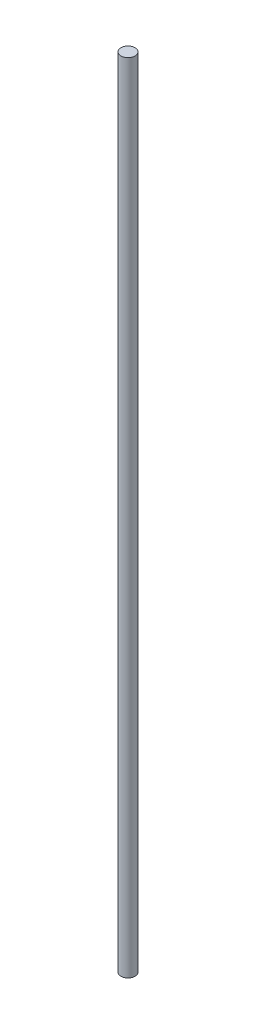
ISO-10303-21;
HEADER;
FILE_DESCRIPTION(('STEP AP214'),'2;1');
FILE_NAME('part.step','',(''),(''),'','','');
FILE_SCHEMA(('AUTOMOTIVE_DESIGN { 1 0 10303 214 1 1 1 1 }'));
ENDSEC;
DATA;
#1=APPLICATION_CONTEXT('core data for automotive mechanical design processes');
#2=APPLICATION_PROTOCOL_DEFINITION('international standard','automotive_design',2000,#1);
#3=PRODUCT_CONTEXT('',#1,'mechanical');
#4=PRODUCT('Part','Part','',(#3));
#5=PRODUCT_RELATED_PRODUCT_CATEGORY('part','',(#4));
#6=PRODUCT_DEFINITION_FORMATION('','',#4);
#7=PRODUCT_DEFINITION_CONTEXT('part definition',#1,'design');
#8=PRODUCT_DEFINITION('design','',#6,#7);
#9=PRODUCT_DEFINITION_SHAPE('','',#8);
#10=(LENGTH_UNIT() NAMED_UNIT(*) SI_UNIT(.MILLI.,.METRE.));
#11=(NAMED_UNIT(*) PLANE_ANGLE_UNIT() SI_UNIT($,.RADIAN.));
#12=(NAMED_UNIT(*) SI_UNIT($,.STERADIAN.) SOLID_ANGLE_UNIT());
#13=UNCERTAINTY_MEASURE_WITH_UNIT(LENGTH_MEASURE(1.E-05),#10,'distance_accuracy_value','');
#14=(GEOMETRIC_REPRESENTATION_CONTEXT(3) GLOBAL_UNCERTAINTY_ASSIGNED_CONTEXT((#13)) GLOBAL_UNIT_ASSIGNED_CONTEXT((#10,
#11,#12)) REPRESENTATION_CONTEXT('',''));
#15=CARTESIAN_POINT('',(0.,0.,0.));
#16=DIRECTION('',(0.,0.,1.));
#17=DIRECTION('',(1.,0.,0.));
#18=AXIS2_PLACEMENT_3D('',#15,#16,#17);
#19=CARTESIAN_POINT('',(0.,560.,0.));
#20=DIRECTION('',(0.,-1.,0.));
#21=DIRECTION('',(0.,0.,-1.));
#22=AXIS2_PLACEMENT_3D('',#19,#20,#21);
#23=CYLINDRICAL_SURFACE('',#22,5.);
#24=CARTESIAN_POINT('',(0.,560.,0.));
#25=DIRECTION('',(0.,1.,0.));
#26=DIRECTION('',(0.,0.,1.));
#27=AXIS2_PLACEMENT_3D('',#24,#25,#26);
#28=CIRCLE('',#27,5.);
#29=CARTESIAN_POINT('',(0.,560.,5.));
#30=VERTEX_POINT('',#29);
#31=EDGE_CURVE('E10',#30,#30,#28,.T.);
#32=ORIENTED_EDGE('',*,*,#31,.F.);
#33=EDGE_LOOP('',(#32));
#34=FACE_BOUND('',#33,.T.);
#35=CARTESIAN_POINT('',(0.,0.,0.));
#36=DIRECTION('',(0.,1.,0.));
#37=DIRECTION('',(0.,0.,1.));
#38=AXIS2_PLACEMENT_3D('',#35,#36,#37);
#39=CIRCLE('',#38,5.);
#40=CARTESIAN_POINT('',(0.,0.,5.));
#41=VERTEX_POINT('',#40);
#42=EDGE_CURVE('E40',#41,#41,#39,.T.);
#43=ORIENTED_EDGE('',*,*,#42,.T.);
#44=EDGE_LOOP('',(#43));
#45=FACE_BOUND('',#44,.T.);
#46=ADVANCED_FACE('F37',(#34,#45),#23,.T.);
#47=CARTESIAN_POINT('',(0.,560.,0.));
#48=DIRECTION('',(0.,1.,0.));
#49=DIRECTION('',(0.,0.,1.));
#50=AXIS2_PLACEMENT_3D('',#47,#48,#49);
#51=PLANE('',#50);
#52=ORIENTED_EDGE('',*,*,#31,.T.);
#53=EDGE_LOOP('',(#52));
#54=FACE_BOUND('',#53,.T.);
#55=ADVANCED_FACE('F52',(#54),#51,.T.);
#56=CARTESIAN_POINT('',(0.,0.,0.));
#57=DIRECTION('',(0.,1.,0.));
#58=DIRECTION('',(0.,0.,1.));
#59=AXIS2_PLACEMENT_3D('',#56,#57,#58);
#60=PLANE('',#59);
#61=ORIENTED_EDGE('',*,*,#42,.F.);
#62=EDGE_LOOP('',(#61));
#63=FACE_BOUND('',#62,.T.);
#64=ADVANCED_FACE('F50',(#63),#60,.F.);
#65=CLOSED_SHELL('',(#46,#55,#64));
#66=MANIFOLD_SOLID_BREP('B2',#65);
#67=ADVANCED_BREP_SHAPE_REPRESENTATION('',(#18,#66),#14);
#68=SHAPE_DEFINITION_REPRESENTATION(#9,#67);
ENDSEC;
END-ISO-10303-21;
